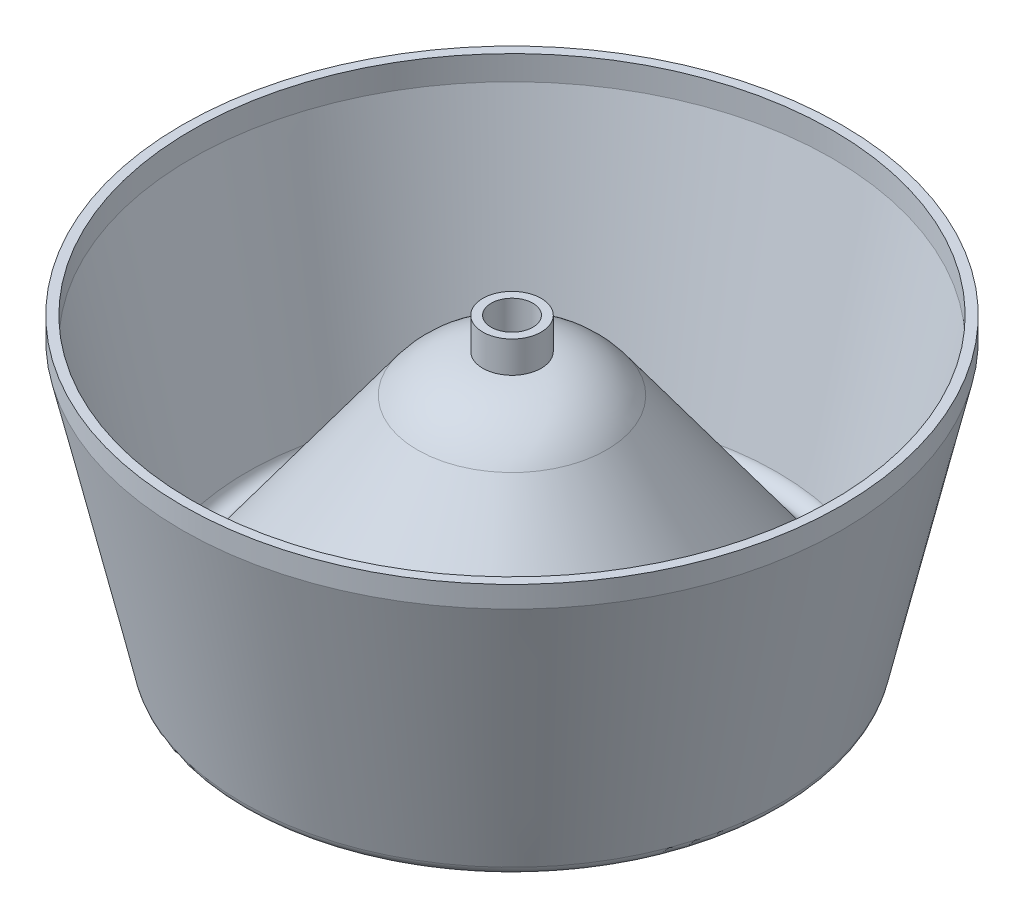
ISO-10303-21;
HEADER;
FILE_DESCRIPTION(('STEP AP214'),'2;1');
FILE_NAME('part.step','',(''),(''),'','','');
FILE_SCHEMA(('AUTOMOTIVE_DESIGN { 1 0 10303 214 1 1 1 1 }'));
ENDSEC;
DATA;
#1=APPLICATION_CONTEXT('core data for automotive mechanical design processes');
#2=APPLICATION_PROTOCOL_DEFINITION('international standard','automotive_design',2000,#1);
#3=PRODUCT_CONTEXT('',#1,'mechanical');
#4=PRODUCT('Part','Part','',(#3));
#5=PRODUCT_RELATED_PRODUCT_CATEGORY('part','',(#4));
#6=PRODUCT_DEFINITION_FORMATION('','',#4);
#7=PRODUCT_DEFINITION_CONTEXT('part definition',#1,'design');
#8=PRODUCT_DEFINITION('design','',#6,#7);
#9=PRODUCT_DEFINITION_SHAPE('','',#8);
#10=(LENGTH_UNIT() NAMED_UNIT(*) SI_UNIT(.MILLI.,.METRE.));
#11=(NAMED_UNIT(*) PLANE_ANGLE_UNIT() SI_UNIT($,.RADIAN.));
#12=(NAMED_UNIT(*) SI_UNIT($,.STERADIAN.) SOLID_ANGLE_UNIT());
#13=UNCERTAINTY_MEASURE_WITH_UNIT(LENGTH_MEASURE(1.E-05),#10,'distance_accuracy_value','');
#14=(GEOMETRIC_REPRESENTATION_CONTEXT(3) GLOBAL_UNCERTAINTY_ASSIGNED_CONTEXT((#13)) GLOBAL_UNIT_ASSIGNED_CONTEXT((#10,
#11,#12)) REPRESENTATION_CONTEXT('',''));
#15=CARTESIAN_POINT('',(0.,0.,0.));
#16=DIRECTION('',(0.,0.,1.));
#17=DIRECTION('',(1.,0.,0.));
#18=AXIS2_PLACEMENT_3D('',#15,#16,#17);
#19=CARTESIAN_POINT('',(0.,7.89459854964833,0.));
#20=DIRECTION('',(0.,1.,0.));
#21=DIRECTION('',(0.,0.,1.));
#22=AXIS2_PLACEMENT_3D('',#19,#20,#21);
#23=DEGENERATE_TOROIDAL_SURFACE('',#22,4.5333456199246,20.4494267457277,.T.);
#24=CARTESIAN_POINT('',(0.,28.3387000930873,0.));
#25=DIRECTION('',(0.,1.,0.));
#26=DIRECTION('',(0.,0.,1.));
#27=AXIS2_PLACEMENT_3D('',#24,#25,#26);
#28=CIRCLE('',#27,5.00000000000001);
#29=CARTESIAN_POINT('',(0.,28.3387000930873,5.));
#30=VERTEX_POINT('',#29);
#31=EDGE_CURVE('E78',#30,#30,#28,.T.);
#32=ORIENTED_EDGE('',*,*,#31,.T.);
#33=EDGE_LOOP('',(#32));
#34=FACE_BOUND('',#33,.T.);
#35=CARTESIAN_POINT('',(0.,19.9267183085166,0.));
#36=DIRECTION('',(0.,1.,0.));
#37=DIRECTION('',(0.,0.,1.));
#38=AXIS2_PLACEMENT_3D('',#35,#36,#37);
#39=CIRCLE('',#38,21.0683735405886);
#40=CARTESIAN_POINT('',(0.,19.9267183085166,21.0683735405886));
#41=VERTEX_POINT('',#40);
#42=EDGE_CURVE('E10',#41,#41,#39,.T.);
#43=ORIENTED_EDGE('',*,*,#42,.F.);
#44=EDGE_LOOP('',(#43));
#45=FACE_BOUND('',#44,.T.);
#46=ADVANCED_FACE('F32',(#34,#45),#23,.F.);
#47=CARTESIAN_POINT('',(0.,-32.4047198308621,0.));
#48=DIRECTION('',(0.,-1.,0.));
#49=DIRECTION('',(0.,0.,-1.));
#50=AXIS2_PLACEMENT_3D('',#47,#48,#49);
#51=CONICAL_SURFACE('',#50,59.1486316367918,0.629059079919701);
#52=ORIENTED_EDGE('',*,*,#42,.T.);
#53=EDGE_LOOP('',(#52));
#54=FACE_BOUND('',#53,.T.);
#55=CARTESIAN_POINT('',(0.,-32.4047198308621,0.));
#56=DIRECTION('',(0.,1.,0.));
#57=DIRECTION('',(0.,0.,1.));
#58=AXIS2_PLACEMENT_3D('',#55,#56,#57);
#59=CIRCLE('',#58,59.1486316367918);
#60=CARTESIAN_POINT('',(0.,-32.4047198308621,59.1486316367918));
#61=VERTEX_POINT('',#60);
#62=EDGE_CURVE('E38',#61,#61,#59,.T.);
#63=ORIENTED_EDGE('',*,*,#62,.F.);
#64=EDGE_LOOP('',(#63));
#65=FACE_BOUND('',#64,.T.);
#66=ADVANCED_FACE('F96',(#54,#65),#51,.F.);
#67=CARTESIAN_POINT('',(0.,-30.6395672070046,0.));
#68=DIRECTION('',(0.,1.,0.));
#69=DIRECTION('',(0.,0.,1.));
#70=AXIS2_PLACEMENT_3D('',#67,#68,#69);
#71=TOROIDAL_SURFACE('',#70,61.5743761028246,2.99999999999999);
#72=ORIENTED_EDGE('',*,*,#62,.T.);
#73=EDGE_LOOP('',(#72));
#74=FACE_BOUND('',#73,.T.);
#75=CARTESIAN_POINT('',(0.,-31.3058337086558,0.));
#76=DIRECTION('',(0.,1.,0.));
#77=DIRECTION('',(0.,0.,1.));
#78=AXIS2_PLACEMENT_3D('',#75,#76,#77);
#79=CIRCLE('',#78,64.4994554092328);
#80=CARTESIAN_POINT('',(0.,-31.3058337086558,64.4994554092328));
#81=VERTEX_POINT('',#80);
#82=EDGE_CURVE('E42',#81,#81,#79,.T.);
#83=ORIENTED_EDGE('',*,*,#82,.F.);
#84=EDGE_LOOP('',(#83));
#85=FACE_BOUND('',#84,.T.);
#86=ADVANCED_FACE('F100',(#74,#85),#71,.T.);
#87=CARTESIAN_POINT('',(0.,32.6139458981491,0.));
#88=DIRECTION('',(0.,1.,0.));
#89=DIRECTION('',(0.,0.,1.));
#90=AXIS2_PLACEMENT_3D('',#87,#88,#89);
#91=CONICAL_SURFACE('',#90,79.0589266179777,0.223956285326343);
#92=ORIENTED_EDGE('',*,*,#82,.T.);
#93=EDGE_LOOP('',(#92));
#94=FACE_BOUND('',#93,.T.);
#95=CARTESIAN_POINT('',(0.,32.6139458981491,0.));
#96=DIRECTION('',(0.,1.,0.));
#97=DIRECTION('',(0.,0.,1.));
#98=AXIS2_PLACEMENT_3D('',#95,#96,#97);
#99=CIRCLE('',#98,79.0589266179777);
#100=CARTESIAN_POINT('',(0.,32.6139458981491,79.0589266179777));
#101=VERTEX_POINT('',#100);
#102=EDGE_CURVE('E46',#101,#101,#99,.T.);
#103=ORIENTED_EDGE('',*,*,#102,.F.);
#104=EDGE_LOOP('',(#103));
#105=FACE_BOUND('',#104,.T.);
#106=ADVANCED_FACE('F104',(#94,#105),#91,.T.);
#107=CARTESIAN_POINT('',(0.,0.,0.));
#108=DIRECTION('',(0.,1.,0.));
#109=DIRECTION('',(0.,0.,1.));
#110=AXIS2_PLACEMENT_3D('',#107,#108,#109);
#111=CYLINDRICAL_SURFACE('',#110,79.0589266179777);
#112=ORIENTED_EDGE('',*,*,#102,.T.);
#113=EDGE_LOOP('',(#112));
#114=FACE_BOUND('',#113,.T.);
#115=CARTESIAN_POINT('',(0.,37.7430553808875,0.));
#116=DIRECTION('',(0.,1.,0.));
#117=DIRECTION('',(0.,0.,1.));
#118=AXIS2_PLACEMENT_3D('',#115,#116,#117);
#119=CIRCLE('',#118,79.0589266179777);
#120=CARTESIAN_POINT('',(0.,37.7430553808875,79.0589266179777));
#121=VERTEX_POINT('',#120);
#122=EDGE_CURVE('E51',#121,#121,#119,.T.);
#123=ORIENTED_EDGE('',*,*,#122,.F.);
#124=EDGE_LOOP('',(#123));
#125=FACE_BOUND('',#124,.T.);
#126=ADVANCED_FACE('F110',(#114,#125),#111,.T.);
#127=CARTESIAN_POINT('',(0.,37.7430553808875,79.0589266179777));
#128=DIRECTION('',(0.,1.,0.));
#129=DIRECTION('',(0.,0.,1.));
#130=AXIS2_PLACEMENT_3D('',#127,#128,#129);
#131=PLANE('',#130);
#132=ORIENTED_EDGE('',*,*,#122,.T.);
#133=EDGE_LOOP('',(#132));
#134=FACE_BOUND('',#133,.T.);
#135=CARTESIAN_POINT('',(0.,37.7430553808875,0.));
#136=DIRECTION('',(0.,1.,0.));
#137=DIRECTION('',(0.,0.,1.));
#138=AXIS2_PLACEMENT_3D('',#135,#136,#137);
#139=CIRCLE('',#138,76.8418703494323);
#140=CARTESIAN_POINT('',(0.,37.7430553808875,76.8418703494323));
#141=VERTEX_POINT('',#140);
#142=EDGE_CURVE('E54',#141,#141,#139,.T.);
#143=ORIENTED_EDGE('',*,*,#142,.F.);
#144=EDGE_LOOP('',(#143));
#145=FACE_BOUND('',#144,.T.);
#146=ADVANCED_FACE('F114',(#134,#145),#131,.T.);
#147=CARTESIAN_POINT('',(0.,0.,0.));
#148=DIRECTION('',(0.,1.,0.));
#149=DIRECTION('',(0.,0.,1.));
#150=AXIS2_PLACEMENT_3D('',#147,#148,#149);
#151=CYLINDRICAL_SURFACE('',#150,76.8418703494323);
#152=ORIENTED_EDGE('',*,*,#142,.T.);
#153=EDGE_LOOP('',(#152));
#154=FACE_BOUND('',#153,.T.);
#155=CARTESIAN_POINT('',(0.,31.8859107784747,0.));
#156=DIRECTION('',(0.,1.,0.));
#157=DIRECTION('',(0.,0.,1.));
#158=AXIS2_PLACEMENT_3D('',#155,#156,#157);
#159=CIRCLE('',#158,76.8418703494323);
#160=CARTESIAN_POINT('',(0.,31.8859107784747,76.8418703494323));
#161=VERTEX_POINT('',#160);
#162=EDGE_CURVE('E57',#161,#161,#159,.T.);
#163=ORIENTED_EDGE('',*,*,#162,.F.);
#164=EDGE_LOOP('',(#163));
#165=FACE_BOUND('',#164,.T.);
#166=ADVANCED_FACE('F118',(#154,#165),#151,.F.);
#167=CARTESIAN_POINT('',(0.,-26.5701749260672,0.));
#168=DIRECTION('',(0.,1.,0.));
#169=DIRECTION('',(0.,0.,1.));
#170=AXIS2_PLACEMENT_3D('',#167,#168,#169);
#171=CONICAL_SURFACE('',#170,63.5269042774811,0.223956285326343);
#172=ORIENTED_EDGE('',*,*,#162,.T.);
#173=EDGE_LOOP('',(#172));
#174=FACE_BOUND('',#173,.T.);
#175=CARTESIAN_POINT('',(0.,-26.5701749260672,0.));
#176=DIRECTION('',(0.,1.,0.));
#177=DIRECTION('',(0.,0.,1.));
#178=AXIS2_PLACEMENT_3D('',#175,#176,#177);
#179=CIRCLE('',#178,63.5269042774811);
#180=CARTESIAN_POINT('',(0.,-26.5701749260672,63.5269042774811));
#181=VERTEX_POINT('',#180);
#182=EDGE_CURVE('E60',#181,#181,#179,.T.);
#183=ORIENTED_EDGE('',*,*,#182,.F.);
#184=EDGE_LOOP('',(#183));
#185=FACE_BOUND('',#184,.T.);
#186=ADVANCED_FACE('F122',(#174,#185),#171,.F.);
#187=CARTESIAN_POINT('',(0.,-25.9039084244159,0.));
#188=DIRECTION('',(0.,1.,0.));
#189=DIRECTION('',(0.,0.,1.));
#190=AXIS2_PLACEMENT_3D('',#187,#188,#189);
#191=TOROIDAL_SURFACE('',#190,60.6018249710729,3.00000000000001);
#192=ORIENTED_EDGE('',*,*,#182,.T.);
#193=EDGE_LOOP('',(#192));
#194=FACE_BOUND('',#193,.T.);
#195=CARTESIAN_POINT('',(0.,-27.6690610482735,0.));
#196=DIRECTION('',(0.,1.,0.));
#197=DIRECTION('',(0.,0.,1.));
#198=AXIS2_PLACEMENT_3D('',#195,#196,#197);
#199=CIRCLE('',#198,58.1760805050401);
#200=CARTESIAN_POINT('',(0.,-27.6690610482735,58.1760805050401));
#201=VERTEX_POINT('',#200);
#202=EDGE_CURVE('E63',#201,#201,#199,.T.);
#203=ORIENTED_EDGE('',*,*,#202,.F.);
#204=EDGE_LOOP('',(#203));
#205=FACE_BOUND('',#204,.T.);
#206=ADVANCED_FACE('F126',(#194,#205),#191,.F.);
#207=CARTESIAN_POINT('',(0.,21.1034867244217,0.));
#208=DIRECTION('',(0.,-1.,0.));
#209=DIRECTION('',(0.,0.,-1.));
#210=AXIS2_PLACEMENT_3D('',#207,#208,#209);
#211=CONICAL_SURFACE('',#210,22.6855365179439,0.629059079919699);
#212=ORIENTED_EDGE('',*,*,#202,.T.);
#213=EDGE_LOOP('',(#212));
#214=FACE_BOUND('',#213,.T.);
#215=CARTESIAN_POINT('',(0.,21.1034867244217,0.));
#216=DIRECTION('',(0.,1.,0.));
#217=DIRECTION('',(0.,0.,1.));
#218=AXIS2_PLACEMENT_3D('',#215,#216,#217);
#219=CIRCLE('',#218,22.6855365179439);
#220=CARTESIAN_POINT('',(0.,21.1034867244217,22.6855365179439));
#221=VERTEX_POINT('',#220);
#222=EDGE_CURVE('E66',#221,#221,#219,.T.);
#223=ORIENTED_EDGE('',*,*,#222,.F.);
#224=EDGE_LOOP('',(#223));
#225=FACE_BOUND('',#224,.T.);
#226=ADVANCED_FACE('F130',(#214,#225),#211,.T.);
#227=CARTESIAN_POINT('',(0.,7.89459854964833,0.));
#228=DIRECTION('',(0.,1.,0.));
#229=DIRECTION('',(0.,0.,1.));
#230=AXIS2_PLACEMENT_3D('',#227,#228,#229);
#231=DEGENERATE_TOROIDAL_SURFACE('',#230,4.5333456199246,22.4494267457279,.T.);
#232=ORIENTED_EDGE('',*,*,#222,.T.);
#233=EDGE_LOOP('',(#232));
#234=FACE_BOUND('',#233,.T.);
#235=CARTESIAN_POINT('',(0.,30.2081006813411,0.));
#236=DIRECTION('',(0.,1.,0.));
#237=DIRECTION('',(0.,0.,1.));
#238=AXIS2_PLACEMENT_3D('',#235,#236,#237);
#239=CIRCLE('',#238,7.);
#240=CARTESIAN_POINT('',(0.,30.2081006813411,7.));
#241=VERTEX_POINT('',#240);
#242=EDGE_CURVE('E69',#241,#241,#239,.T.);
#243=ORIENTED_EDGE('',*,*,#242,.F.);
#244=EDGE_LOOP('',(#243));
#245=FACE_BOUND('',#244,.T.);
#246=ADVANCED_FACE('F134',(#234,#245),#231,.T.);
#247=CARTESIAN_POINT('',(0.,0.,0.));
#248=DIRECTION('',(0.,1.,0.));
#249=DIRECTION('',(0.,0.,1.));
#250=AXIS2_PLACEMENT_3D('',#247,#248,#249);
#251=CYLINDRICAL_SURFACE('',#250,7.00000000000001);
#252=ORIENTED_EDGE('',*,*,#242,.T.);
#253=EDGE_LOOP('',(#252));
#254=FACE_BOUND('',#253,.T.);
#255=CARTESIAN_POINT('',(0.,37.7430553808875,0.));
#256=DIRECTION('',(0.,1.,0.));
#257=DIRECTION('',(0.,0.,1.));
#258=AXIS2_PLACEMENT_3D('',#255,#256,#257);
#259=CIRCLE('',#258,7.00000000000001);
#260=CARTESIAN_POINT('',(0.,37.7430553808875,7.));
#261=VERTEX_POINT('',#260);
#262=EDGE_CURVE('E72',#261,#261,#259,.T.);
#263=ORIENTED_EDGE('',*,*,#262,.F.);
#264=EDGE_LOOP('',(#263));
#265=FACE_BOUND('',#264,.T.);
#266=ADVANCED_FACE('F92',(#254,#265),#251,.T.);
#267=CARTESIAN_POINT('',(0.,37.7430553808875,7.));
#268=DIRECTION('',(0.,1.,0.));
#269=DIRECTION('',(0.,0.,1.));
#270=AXIS2_PLACEMENT_3D('',#267,#268,#269);
#271=PLANE('',#270);
#272=ORIENTED_EDGE('',*,*,#262,.T.);
#273=EDGE_LOOP('',(#272));
#274=FACE_BOUND('',#273,.T.);
#275=CARTESIAN_POINT('',(0.,37.7430553808875,0.));
#276=DIRECTION('',(0.,1.,0.));
#277=DIRECTION('',(0.,0.,1.));
#278=AXIS2_PLACEMENT_3D('',#275,#276,#277);
#279=CIRCLE('',#278,5.00000000000001);
#280=CARTESIAN_POINT('',(0.,37.7430553808875,5.));
#281=VERTEX_POINT('',#280);
#282=EDGE_CURVE('E75',#281,#281,#279,.T.);
#283=ORIENTED_EDGE('',*,*,#282,.F.);
#284=EDGE_LOOP('',(#283));
#285=FACE_BOUND('',#284,.T.);
#286=ADVANCED_FACE('F86',(#274,#285),#271,.T.);
#287=CARTESIAN_POINT('',(0.,0.,0.));
#288=DIRECTION('',(0.,1.,0.));
#289=DIRECTION('',(0.,0.,1.));
#290=AXIS2_PLACEMENT_3D('',#287,#288,#289);
#291=CYLINDRICAL_SURFACE('',#290,5.00000000000001);
#292=ORIENTED_EDGE('',*,*,#282,.T.);
#293=EDGE_LOOP('',(#292));
#294=FACE_BOUND('',#293,.T.);
#295=ORIENTED_EDGE('',*,*,#31,.F.);
#296=EDGE_LOOP('',(#295));
#297=FACE_BOUND('',#296,.T.);
#298=ADVANCED_FACE('F84',(#294,#297),#291,.F.);
#299=CLOSED_SHELL('',(#46,#66,#86,#106,#126,#146,#166,#186,#206,#226,#246,#266,#286,#298));
#300=MANIFOLD_SOLID_BREP('B2',#299);
#301=ADVANCED_BREP_SHAPE_REPRESENTATION('',(#18,#300),#14);
#302=SHAPE_DEFINITION_REPRESENTATION(#9,#301);
ENDSEC;
END-ISO-10303-21;
